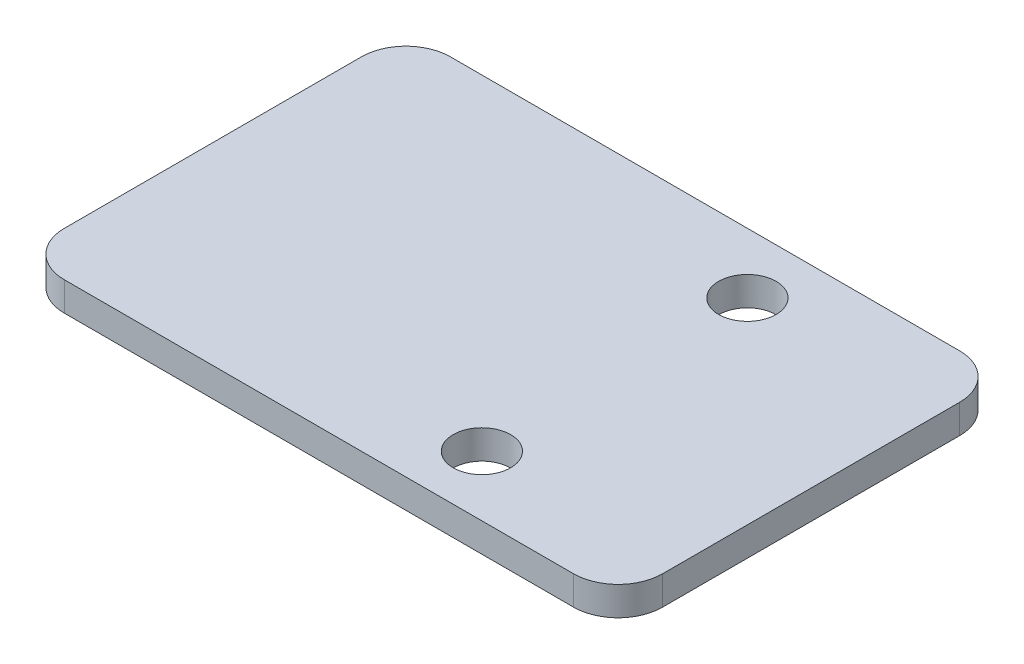
ISO-10303-21;
HEADER;
FILE_DESCRIPTION(('STEP AP214'),'2;1');
FILE_NAME('part.step','',(''),(''),'','','');
FILE_SCHEMA(('AUTOMOTIVE_DESIGN { 1 0 10303 214 1 1 1 1 }'));
ENDSEC;
DATA;
#1=APPLICATION_CONTEXT('core data for automotive mechanical design processes');
#2=APPLICATION_PROTOCOL_DEFINITION('international standard','automotive_design',2000,#1);
#3=PRODUCT_CONTEXT('',#1,'mechanical');
#4=PRODUCT('Part','Part','',(#3));
#5=PRODUCT_RELATED_PRODUCT_CATEGORY('part','',(#4));
#6=PRODUCT_DEFINITION_FORMATION('','',#4);
#7=PRODUCT_DEFINITION_CONTEXT('part definition',#1,'design');
#8=PRODUCT_DEFINITION('design','',#6,#7);
#9=PRODUCT_DEFINITION_SHAPE('','',#8);
#10=(LENGTH_UNIT() NAMED_UNIT(*) SI_UNIT(.MILLI.,.METRE.));
#11=(NAMED_UNIT(*) PLANE_ANGLE_UNIT() SI_UNIT($,.RADIAN.));
#12=(NAMED_UNIT(*) SI_UNIT($,.STERADIAN.) SOLID_ANGLE_UNIT());
#13=UNCERTAINTY_MEASURE_WITH_UNIT(LENGTH_MEASURE(1.E-05),#10,'distance_accuracy_value','');
#14=(GEOMETRIC_REPRESENTATION_CONTEXT(3) GLOBAL_UNCERTAINTY_ASSIGNED_CONTEXT((#13)) GLOBAL_UNIT_ASSIGNED_CONTEXT((#10,
#11,#12)) REPRESENTATION_CONTEXT('',''));
#15=CARTESIAN_POINT('',(0.,0.,0.));
#16=DIRECTION('',(0.,0.,1.));
#17=DIRECTION('',(1.,0.,0.));
#18=AXIS2_PLACEMENT_3D('',#15,#16,#17);
#19=CARTESIAN_POINT('',(0.,1.651,0.));
#20=DIRECTION('',(1.,0.,0.));
#21=DIRECTION('',(0.,0.,-1.));
#22=AXIS2_PLACEMENT_3D('',#19,#20,#21);
#23=PLANE('',#22);
#24=DIRECTION('',(0.,0.,1.));
#25=VECTOR('',#24,1.);
#26=CARTESIAN_POINT('',(0.,0.,0.));
#27=LINE('',#26,#25);
#28=CARTESIAN_POINT('',(0.,0.,-19.4865625));
#29=VERTEX_POINT('',#28);
#30=CARTESIAN_POINT('',(0.,0.,-2.54));
#31=VERTEX_POINT('',#30);
#32=EDGE_CURVE('E141',#29,#31,#27,.T.);
#33=ORIENTED_EDGE('',*,*,#32,.T.);
#34=DIRECTION('',(0.,-1.,0.));
#35=VECTOR('',#34,1.);
#36=CARTESIAN_POINT('',(0.,1.651,-2.54));
#37=LINE('',#36,#35);
#38=CARTESIAN_POINT('',(0.,1.651,-2.54));
#39=VERTEX_POINT('',#38);
#40=EDGE_CURVE('E116',#31,#39,#37,.F.);
#41=ORIENTED_EDGE('',*,*,#40,.T.);
#42=DIRECTION('',(0.,0.,1.));
#43=VECTOR('',#42,1.);
#44=CARTESIAN_POINT('',(0.,1.651,0.));
#45=LINE('',#44,#43);
#46=CARTESIAN_POINT('',(0.,1.651,-19.4865625));
#47=VERTEX_POINT('',#46);
#48=EDGE_CURVE('E153',#47,#39,#45,.T.);
#49=ORIENTED_EDGE('',*,*,#48,.F.);
#50=DIRECTION('',(0.,-1.,0.));
#51=VECTOR('',#50,1.);
#52=CARTESIAN_POINT('',(0.,1.651,-19.4865625));
#53=LINE('',#52,#51);
#54=EDGE_CURVE('E122',#47,#29,#53,.T.);
#55=ORIENTED_EDGE('',*,*,#54,.T.);
#56=EDGE_LOOP('',(#33,#41,#49,#55));
#57=FACE_BOUND('',#56,.T.);
#58=ADVANCED_FACE('F42',(#57),#23,.F.);
#59=CARTESIAN_POINT('',(0.,1.651,0.));
#60=DIRECTION('',(0.,0.,-1.));
#61=DIRECTION('',(-1.,0.,0.));
#62=AXIS2_PLACEMENT_3D('',#59,#60,#61);
#63=PLANE('',#62);
#64=DIRECTION('',(1.,0.,0.));
#65=VECTOR('',#64,1.);
#66=CARTESIAN_POINT('',(0.,1.651,0.));
#67=LINE('',#66,#65);
#68=CARTESIAN_POINT('',(2.54,1.651,0.));
#69=VERTEX_POINT('',#68);
#70=CARTESIAN_POINT('',(31.59125,1.651,0.));
#71=VERTEX_POINT('',#70);
#72=EDGE_CURVE('E132',#69,#71,#67,.T.);
#73=ORIENTED_EDGE('',*,*,#72,.F.);
#74=DIRECTION('',(0.,-1.,0.));
#75=VECTOR('',#74,1.);
#76=CARTESIAN_POINT('',(2.54,1.651,0.));
#77=LINE('',#76,#75);
#78=CARTESIAN_POINT('',(2.54,0.,0.));
#79=VERTEX_POINT('',#78);
#80=EDGE_CURVE('E115',#69,#79,#77,.T.);
#81=ORIENTED_EDGE('',*,*,#80,.T.);
#82=DIRECTION('',(1.,0.,0.));
#83=VECTOR('',#82,1.);
#84=CARTESIAN_POINT('',(0.,0.,0.));
#85=LINE('',#84,#83);
#86=CARTESIAN_POINT('',(31.59125,0.,0.));
#87=VERTEX_POINT('',#86);
#88=EDGE_CURVE('E129',#79,#87,#85,.T.);
#89=ORIENTED_EDGE('',*,*,#88,.T.);
#90=DIRECTION('',(0.,-1.,0.));
#91=VECTOR('',#90,1.);
#92=CARTESIAN_POINT('',(31.59125,1.651,0.));
#93=LINE('',#92,#91);
#94=EDGE_CURVE('E135',#87,#71,#93,.F.);
#95=ORIENTED_EDGE('',*,*,#94,.T.);
#96=EDGE_LOOP('',(#73,#81,#89,#95));
#97=FACE_BOUND('',#96,.T.);
#98=ADVANCED_FACE('F128',(#97),#63,.F.);
#99=CARTESIAN_POINT('',(34.13125,1.651,0.));
#100=DIRECTION('',(-1.,0.,0.));
#101=DIRECTION('',(0.,0.,1.));
#102=AXIS2_PLACEMENT_3D('',#99,#100,#101);
#103=PLANE('',#102);
#104=DIRECTION('',(0.,0.,-1.));
#105=VECTOR('',#104,1.);
#106=CARTESIAN_POINT('',(34.13125,0.,0.));
#107=LINE('',#106,#105);
#108=CARTESIAN_POINT('',(34.13125,0.,-2.54));
#109=VERTEX_POINT('',#108);
#110=CARTESIAN_POINT('',(34.13125,0.,-19.4865625));
#111=VERTEX_POINT('',#110);
#112=EDGE_CURVE('E140',#109,#111,#107,.T.);
#113=ORIENTED_EDGE('',*,*,#112,.T.);
#114=DIRECTION('',(0.,-1.,0.));
#115=VECTOR('',#114,1.);
#116=CARTESIAN_POINT('',(34.13125,1.651,-19.4865625));
#117=LINE('',#116,#115);
#118=CARTESIAN_POINT('',(34.13125,1.651,-19.4865625));
#119=VERTEX_POINT('',#118);
#120=EDGE_CURVE('E11',#111,#119,#117,.F.);
#121=ORIENTED_EDGE('',*,*,#120,.T.);
#122=DIRECTION('',(0.,0.,-1.));
#123=VECTOR('',#122,1.);
#124=CARTESIAN_POINT('',(34.13125,1.651,0.));
#125=LINE('',#124,#123);
#126=CARTESIAN_POINT('',(34.13125,1.651,-2.54));
#127=VERTEX_POINT('',#126);
#128=EDGE_CURVE('E211',#127,#119,#125,.T.);
#129=ORIENTED_EDGE('',*,*,#128,.F.);
#130=DIRECTION('',(0.,-1.,0.));
#131=VECTOR('',#130,1.);
#132=CARTESIAN_POINT('',(34.13125,1.651,-2.54));
#133=LINE('',#132,#131);
#134=EDGE_CURVE('E52',#127,#109,#133,.T.);
#135=ORIENTED_EDGE('',*,*,#134,.T.);
#136=EDGE_LOOP('',(#113,#121,#129,#135));
#137=FACE_BOUND('',#136,.T.);
#138=ADVANCED_FACE('F228',(#137),#103,.F.);
#139=CARTESIAN_POINT('',(0.,1.651,-22.0265625));
#140=DIRECTION('',(0.,0.,1.));
#141=DIRECTION('',(1.,0.,0.));
#142=AXIS2_PLACEMENT_3D('',#139,#140,#141);
#143=PLANE('',#142);
#144=DIRECTION('',(-1.,0.,0.));
#145=VECTOR('',#144,1.);
#146=CARTESIAN_POINT('',(0.,0.,-22.0265625));
#147=LINE('',#146,#145);
#148=CARTESIAN_POINT('',(31.59125,0.,-22.0265625));
#149=VERTEX_POINT('',#148);
#150=CARTESIAN_POINT('',(2.54,0.,-22.0265625));
#151=VERTEX_POINT('',#150);
#152=EDGE_CURVE('E146',#149,#151,#147,.T.);
#153=ORIENTED_EDGE('',*,*,#152,.T.);
#154=DIRECTION('',(0.,-1.,0.));
#155=VECTOR('',#154,1.);
#156=CARTESIAN_POINT('',(2.54,1.651,-22.0265625));
#157=LINE('',#156,#155);
#158=CARTESIAN_POINT('',(2.54,1.651,-22.0265625));
#159=VERTEX_POINT('',#158);
#160=EDGE_CURVE('E60',#151,#159,#157,.F.);
#161=ORIENTED_EDGE('',*,*,#160,.T.);
#162=DIRECTION('',(-1.,0.,0.));
#163=VECTOR('',#162,1.);
#164=CARTESIAN_POINT('',(0.,1.651,-22.0265625));
#165=LINE('',#164,#163);
#166=CARTESIAN_POINT('',(31.59125,1.651,-22.0265625));
#167=VERTEX_POINT('',#166);
#168=EDGE_CURVE('E155',#167,#159,#165,.T.);
#169=ORIENTED_EDGE('',*,*,#168,.F.);
#170=DIRECTION('',(0.,-1.,0.));
#171=VECTOR('',#170,1.);
#172=CARTESIAN_POINT('',(31.59125,1.651,-22.0265625));
#173=LINE('',#172,#171);
#174=EDGE_CURVE('E180',#167,#149,#173,.T.);
#175=ORIENTED_EDGE('',*,*,#174,.T.);
#176=EDGE_LOOP('',(#153,#161,#169,#175));
#177=FACE_BOUND('',#176,.T.);
#178=ADVANCED_FACE('F223',(#177),#143,.F.);
#179=CARTESIAN_POINT('',(0.,1.651,0.));
#180=DIRECTION('',(0.,-1.,0.));
#181=DIRECTION('',(0.,0.,-1.));
#182=AXIS2_PLACEMENT_3D('',#179,#180,#181);
#183=PLANE('',#182);
#184=CARTESIAN_POINT('',(22.92125,1.651,-18.5865625));
#185=DIRECTION('',(0.,1.,0.));
#186=DIRECTION('',(0.,0.,1.));
#187=AXIS2_PLACEMENT_3D('',#184,#185,#186);
#188=CIRCLE('',#187,1.64);
#189=CARTESIAN_POINT('',(22.92125,1.651,-16.9465625));
#190=VERTEX_POINT('',#189);
#191=EDGE_CURVE('E191',#190,#190,#188,.T.);
#192=ORIENTED_EDGE('',*,*,#191,.F.);
#193=EDGE_LOOP('',(#192));
#194=FACE_BOUND('',#193,.T.);
#195=CARTESIAN_POINT('',(22.92125,1.651,-3.44));
#196=DIRECTION('',(0.,1.,0.));
#197=DIRECTION('',(0.,0.,1.));
#198=AXIS2_PLACEMENT_3D('',#195,#196,#197);
#199=CIRCLE('',#198,1.64);
#200=CARTESIAN_POINT('',(22.92125,1.651,-1.8));
#201=VERTEX_POINT('',#200);
#202=EDGE_CURVE('E198',#201,#201,#199,.T.);
#203=ORIENTED_EDGE('',*,*,#202,.F.);
#204=EDGE_LOOP('',(#203));
#205=FACE_BOUND('',#204,.T.);
#206=ORIENTED_EDGE('',*,*,#48,.T.);
#207=CARTESIAN_POINT('',(2.54,1.651,-2.54));
#208=DIRECTION('',(0.,-1.,0.));
#209=DIRECTION('',(0.,0.,-1.));
#210=AXIS2_PLACEMENT_3D('',#207,#208,#209);
#211=CIRCLE('',#210,2.54);
#212=EDGE_CURVE('E177',#39,#69,#211,.F.);
#213=ORIENTED_EDGE('',*,*,#212,.T.);
#214=ORIENTED_EDGE('',*,*,#72,.T.);
#215=CARTESIAN_POINT('',(31.59125,1.651,-2.54));
#216=DIRECTION('',(0.,-1.,0.));
#217=DIRECTION('',(0.,0.,-1.));
#218=AXIS2_PLACEMENT_3D('',#215,#216,#217);
#219=CIRCLE('',#218,2.54);
#220=EDGE_CURVE('E169',#71,#127,#219,.F.);
#221=ORIENTED_EDGE('',*,*,#220,.T.);
#222=ORIENTED_EDGE('',*,*,#128,.T.);
#223=CARTESIAN_POINT('',(31.59125,1.651,-19.4865625));
#224=DIRECTION('',(0.,-1.,0.));
#225=DIRECTION('',(0.,0.,-1.));
#226=AXIS2_PLACEMENT_3D('',#223,#224,#225);
#227=CIRCLE('',#226,2.54);
#228=EDGE_CURVE('E67',#119,#167,#227,.F.);
#229=ORIENTED_EDGE('',*,*,#228,.T.);
#230=ORIENTED_EDGE('',*,*,#168,.T.);
#231=CARTESIAN_POINT('',(2.54,1.651,-19.4865625));
#232=DIRECTION('',(0.,-1.,0.));
#233=DIRECTION('',(0.,0.,-1.));
#234=AXIS2_PLACEMENT_3D('',#231,#232,#233);
#235=CIRCLE('',#234,2.54);
#236=EDGE_CURVE('E174',#159,#47,#235,.F.);
#237=ORIENTED_EDGE('',*,*,#236,.T.);
#238=EDGE_LOOP('',(#206,#213,#214,#221,#222,#229,#230,#237));
#239=FACE_BOUND('',#238,.T.);
#240=ADVANCED_FACE('F215',(#194,#205,#239),#183,.F.);
#241=CARTESIAN_POINT('',(0.,0.,0.));
#242=DIRECTION('',(0.,-1.,0.));
#243=DIRECTION('',(0.,0.,-1.));
#244=AXIS2_PLACEMENT_3D('',#241,#242,#243);
#245=PLANE('',#244);
#246=CARTESIAN_POINT('',(22.92125,0.,-18.5865625));
#247=DIRECTION('',(0.,-1.,0.));
#248=DIRECTION('',(0.,0.,-1.));
#249=AXIS2_PLACEMENT_3D('',#246,#247,#248);
#250=CIRCLE('',#249,1.64);
#251=CARTESIAN_POINT('',(22.92125,0.,-20.2265625));
#252=VERTEX_POINT('',#251);
#253=EDGE_CURVE('E46',#252,#252,#250,.T.);
#254=ORIENTED_EDGE('',*,*,#253,.F.);
#255=EDGE_LOOP('',(#254));
#256=FACE_BOUND('',#255,.T.);
#257=CARTESIAN_POINT('',(22.92125,0.,-3.44));
#258=DIRECTION('',(0.,-1.,0.));
#259=DIRECTION('',(0.,0.,-1.));
#260=AXIS2_PLACEMENT_3D('',#257,#258,#259);
#261=CIRCLE('',#260,1.64);
#262=CARTESIAN_POINT('',(22.92125,0.,-5.08));
#263=VERTEX_POINT('',#262);
#264=EDGE_CURVE('E188',#263,#263,#261,.T.);
#265=ORIENTED_EDGE('',*,*,#264,.F.);
#266=EDGE_LOOP('',(#265));
#267=FACE_BOUND('',#266,.T.);
#268=ORIENTED_EDGE('',*,*,#88,.F.);
#269=CARTESIAN_POINT('',(2.54,0.,-2.54));
#270=DIRECTION('',(0.,-1.,0.));
#271=DIRECTION('',(0.,0.,-1.));
#272=AXIS2_PLACEMENT_3D('',#269,#270,#271);
#273=CIRCLE('',#272,2.54);
#274=EDGE_CURVE('E111',#79,#31,#273,.T.);
#275=ORIENTED_EDGE('',*,*,#274,.T.);
#276=ORIENTED_EDGE('',*,*,#32,.F.);
#277=CARTESIAN_POINT('',(2.54,0.,-19.4865625));
#278=DIRECTION('',(0.,-1.,0.));
#279=DIRECTION('',(0.,0.,-1.));
#280=AXIS2_PLACEMENT_3D('',#277,#278,#279);
#281=CIRCLE('',#280,2.54);
#282=EDGE_CURVE('E123',#29,#151,#281,.T.);
#283=ORIENTED_EDGE('',*,*,#282,.T.);
#284=ORIENTED_EDGE('',*,*,#152,.F.);
#285=CARTESIAN_POINT('',(31.59125,0.,-19.4865625));
#286=DIRECTION('',(0.,-1.,0.));
#287=DIRECTION('',(0.,0.,-1.));
#288=AXIS2_PLACEMENT_3D('',#285,#286,#287);
#289=CIRCLE('',#288,2.54);
#290=EDGE_CURVE('E159',#149,#111,#289,.T.);
#291=ORIENTED_EDGE('',*,*,#290,.T.);
#292=ORIENTED_EDGE('',*,*,#112,.F.);
#293=CARTESIAN_POINT('',(31.59125,0.,-2.54));
#294=DIRECTION('',(0.,-1.,0.));
#295=DIRECTION('',(0.,0.,-1.));
#296=AXIS2_PLACEMENT_3D('',#293,#294,#295);
#297=CIRCLE('',#296,2.54);
#298=EDGE_CURVE('E134',#109,#87,#297,.T.);
#299=ORIENTED_EDGE('',*,*,#298,.T.);
#300=EDGE_LOOP('',(#268,#275,#276,#283,#284,#291,#292,#299));
#301=FACE_BOUND('',#300,.T.);
#302=ADVANCED_FACE('F137',(#256,#267,#301),#245,.T.);
#303=CARTESIAN_POINT('',(2.54,1.651,-2.54));
#304=DIRECTION('',(0.,-1.,0.));
#305=DIRECTION('',(0.,0.,-1.));
#306=AXIS2_PLACEMENT_3D('',#303,#304,#305);
#307=CYLINDRICAL_SURFACE('',#306,2.54);
#308=ORIENTED_EDGE('',*,*,#212,.F.);
#309=ORIENTED_EDGE('',*,*,#40,.F.);
#310=ORIENTED_EDGE('',*,*,#274,.F.);
#311=ORIENTED_EDGE('',*,*,#80,.F.);
#312=EDGE_LOOP('',(#308,#309,#310,#311));
#313=FACE_BOUND('',#312,.T.);
#314=ADVANCED_FACE('F114',(#313),#307,.T.);
#315=CARTESIAN_POINT('',(2.54,1.651,-19.4865625));
#316=DIRECTION('',(0.,-1.,0.));
#317=DIRECTION('',(0.,0.,-1.));
#318=AXIS2_PLACEMENT_3D('',#315,#316,#317);
#319=CYLINDRICAL_SURFACE('',#318,2.54);
#320=ORIENTED_EDGE('',*,*,#236,.F.);
#321=ORIENTED_EDGE('',*,*,#160,.F.);
#322=ORIENTED_EDGE('',*,*,#282,.F.);
#323=ORIENTED_EDGE('',*,*,#54,.F.);
#324=EDGE_LOOP('',(#320,#321,#322,#323));
#325=FACE_BOUND('',#324,.T.);
#326=ADVANCED_FACE('F220',(#325),#319,.T.);
#327=CARTESIAN_POINT('',(31.59125,1.651,-19.4865625));
#328=DIRECTION('',(0.,-1.,0.));
#329=DIRECTION('',(0.,0.,-1.));
#330=AXIS2_PLACEMENT_3D('',#327,#328,#329);
#331=CYLINDRICAL_SURFACE('',#330,2.54);
#332=ORIENTED_EDGE('',*,*,#228,.F.);
#333=ORIENTED_EDGE('',*,*,#120,.F.);
#334=ORIENTED_EDGE('',*,*,#290,.F.);
#335=ORIENTED_EDGE('',*,*,#174,.F.);
#336=EDGE_LOOP('',(#332,#333,#334,#335));
#337=FACE_BOUND('',#336,.T.);
#338=ADVANCED_FACE('F225',(#337),#331,.T.);
#339=CARTESIAN_POINT('',(31.59125,1.651,-2.54));
#340=DIRECTION('',(0.,-1.,0.));
#341=DIRECTION('',(0.,0.,-1.));
#342=AXIS2_PLACEMENT_3D('',#339,#340,#341);
#343=CYLINDRICAL_SURFACE('',#342,2.54);
#344=ORIENTED_EDGE('',*,*,#220,.F.);
#345=ORIENTED_EDGE('',*,*,#94,.F.);
#346=ORIENTED_EDGE('',*,*,#298,.F.);
#347=ORIENTED_EDGE('',*,*,#134,.F.);
#348=EDGE_LOOP('',(#344,#345,#346,#347));
#349=FACE_BOUND('',#348,.T.);
#350=ADVANCED_FACE('F44',(#349),#343,.T.);
#351=CARTESIAN_POINT('',(22.92125,-0.889,-3.44));
#352=DIRECTION('',(0.,1.,0.));
#353=DIRECTION('',(0.,0.,1.));
#354=AXIS2_PLACEMENT_3D('',#351,#352,#353);
#355=CYLINDRICAL_SURFACE('',#354,1.64);
#356=ORIENTED_EDGE('',*,*,#264,.T.);
#357=EDGE_LOOP('',(#356));
#358=FACE_BOUND('',#357,.T.);
#359=ORIENTED_EDGE('',*,*,#202,.T.);
#360=EDGE_LOOP('',(#359));
#361=FACE_BOUND('',#360,.T.);
#362=ADVANCED_FACE('F234',(#358,#361),#355,.F.);
#363=CARTESIAN_POINT('',(22.92125,-0.889,-18.5865625));
#364=DIRECTION('',(0.,1.,0.));
#365=DIRECTION('',(0.,0.,1.));
#366=AXIS2_PLACEMENT_3D('',#363,#364,#365);
#367=CYLINDRICAL_SURFACE('',#366,1.64);
#368=ORIENTED_EDGE('',*,*,#253,.T.);
#369=EDGE_LOOP('',(#368));
#370=FACE_BOUND('',#369,.T.);
#371=ORIENTED_EDGE('',*,*,#191,.T.);
#372=EDGE_LOOP('',(#371));
#373=FACE_BOUND('',#372,.T.);
#374=ADVANCED_FACE('F239',(#370,#373),#367,.F.);
#375=CLOSED_SHELL('',(#58,#98,#138,#178,#240,#302,#314,#326,#338,#350,#362,#374));
#376=MANIFOLD_SOLID_BREP('B2',#375);
#377=ADVANCED_BREP_SHAPE_REPRESENTATION('',(#18,#376),#14);
#378=SHAPE_DEFINITION_REPRESENTATION(#9,#377);
ENDSEC;
END-ISO-10303-21;
